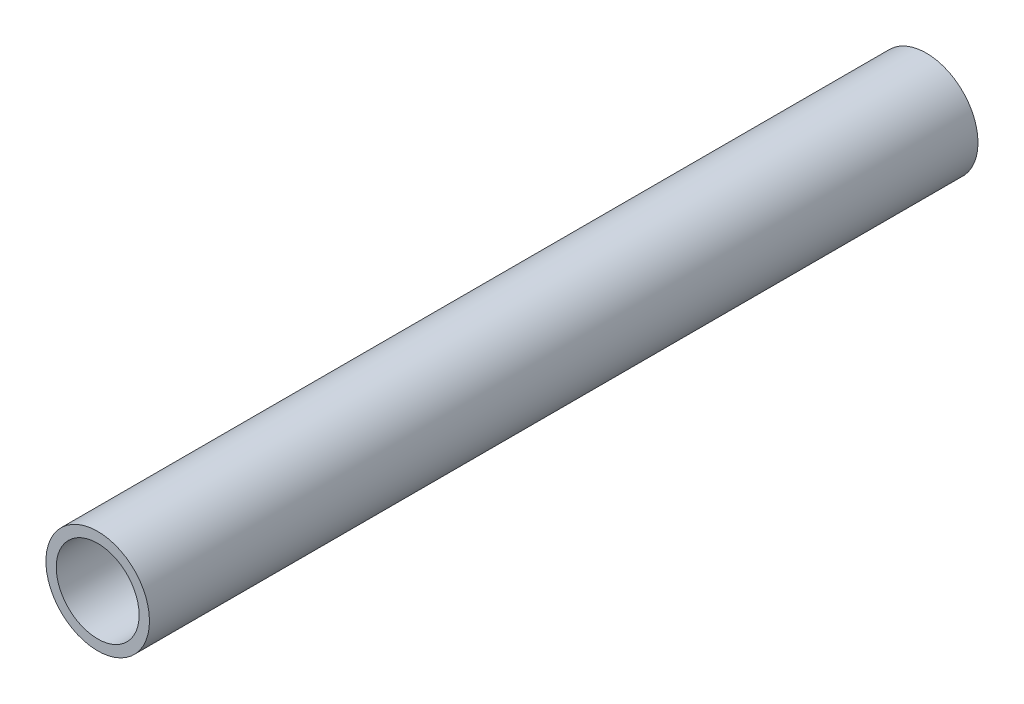
ISO-10303-21;
HEADER;
FILE_DESCRIPTION(('STEP AP214'),'2;1');
FILE_NAME('part.step','',(''),(''),'','','');
FILE_SCHEMA(('AUTOMOTIVE_DESIGN { 1 0 10303 214 1 1 1 1 }'));
ENDSEC;
DATA;
#1=APPLICATION_CONTEXT('core data for automotive mechanical design processes');
#2=APPLICATION_PROTOCOL_DEFINITION('international standard','automotive_design',2000,#1);
#3=PRODUCT_CONTEXT('',#1,'mechanical');
#4=PRODUCT('Part','Part','',(#3));
#5=PRODUCT_RELATED_PRODUCT_CATEGORY('part','',(#4));
#6=PRODUCT_DEFINITION_FORMATION('','',#4);
#7=PRODUCT_DEFINITION_CONTEXT('part definition',#1,'design');
#8=PRODUCT_DEFINITION('design','',#6,#7);
#9=PRODUCT_DEFINITION_SHAPE('','',#8);
#10=(LENGTH_UNIT() NAMED_UNIT(*) SI_UNIT(.MILLI.,.METRE.));
#11=(NAMED_UNIT(*) PLANE_ANGLE_UNIT() SI_UNIT($,.RADIAN.));
#12=(NAMED_UNIT(*) SI_UNIT($,.STERADIAN.) SOLID_ANGLE_UNIT());
#13=UNCERTAINTY_MEASURE_WITH_UNIT(LENGTH_MEASURE(1.E-05),#10,'distance_accuracy_value','');
#14=(GEOMETRIC_REPRESENTATION_CONTEXT(3) GLOBAL_UNCERTAINTY_ASSIGNED_CONTEXT((#13)) GLOBAL_UNIT_ASSIGNED_CONTEXT((#10,
#11,#12)) REPRESENTATION_CONTEXT('',''));
#15=CARTESIAN_POINT('',(0.,0.,0.));
#16=DIRECTION('',(0.,0.,1.));
#17=DIRECTION('',(1.,0.,0.));
#18=AXIS2_PLACEMENT_3D('',#15,#16,#17);
#19=CARTESIAN_POINT('',(0.,0.,160.));
#20=DIRECTION('',(0.,0.,1.));
#21=DIRECTION('',(1.,0.,0.));
#22=AXIS2_PLACEMENT_3D('',#19,#20,#21);
#23=PLANE('',#22);
#24=CARTESIAN_POINT('',(0.,0.,160.));
#25=DIRECTION('',(0.,0.,1.));
#26=DIRECTION('',(1.,0.,0.));
#27=AXIS2_PLACEMENT_3D('',#24,#25,#26);
#28=CIRCLE('',#27,10.);
#29=CARTESIAN_POINT('',(10.,0.,160.));
#30=VERTEX_POINT('',#29);
#31=EDGE_CURVE('E10',#30,#30,#28,.T.);
#32=ORIENTED_EDGE('',*,*,#31,.T.);
#33=EDGE_LOOP('',(#32));
#34=FACE_BOUND('',#33,.T.);
#35=CARTESIAN_POINT('',(0.,0.,160.));
#36=DIRECTION('',(0.,0.,1.));
#37=DIRECTION('',(1.,0.,0.));
#38=AXIS2_PLACEMENT_3D('',#35,#36,#37);
#39=CIRCLE('',#38,8.);
#40=CARTESIAN_POINT('',(8.,0.,160.));
#41=VERTEX_POINT('',#40);
#42=EDGE_CURVE('E42',#41,#41,#39,.T.);
#43=ORIENTED_EDGE('',*,*,#42,.F.);
#44=EDGE_LOOP('',(#43));
#45=FACE_BOUND('',#44,.T.);
#46=ADVANCED_FACE('F31',(#34,#45),#23,.T.);
#47=CARTESIAN_POINT('',(0.,0.,0.));
#48=DIRECTION('',(0.,0.,1.));
#49=DIRECTION('',(1.,0.,0.));
#50=AXIS2_PLACEMENT_3D('',#47,#48,#49);
#51=PLANE('',#50);
#52=CARTESIAN_POINT('',(0.,0.,0.));
#53=DIRECTION('',(0.,0.,1.));
#54=DIRECTION('',(1.,0.,0.));
#55=AXIS2_PLACEMENT_3D('',#52,#53,#54);
#56=CIRCLE('',#55,10.);
#57=CARTESIAN_POINT('',(10.,0.,0.));
#58=VERTEX_POINT('',#57);
#59=EDGE_CURVE('E35',#58,#58,#56,.T.);
#60=ORIENTED_EDGE('',*,*,#59,.F.);
#61=EDGE_LOOP('',(#60));
#62=FACE_BOUND('',#61,.T.);
#63=CARTESIAN_POINT('',(0.,0.,0.));
#64=DIRECTION('',(0.,0.,1.));
#65=DIRECTION('',(1.,0.,0.));
#66=AXIS2_PLACEMENT_3D('',#63,#64,#65);
#67=CIRCLE('',#66,8.);
#68=CARTESIAN_POINT('',(8.,0.,0.));
#69=VERTEX_POINT('',#68);
#70=EDGE_CURVE('E44',#69,#69,#67,.T.);
#71=ORIENTED_EDGE('',*,*,#70,.T.);
#72=EDGE_LOOP('',(#71));
#73=FACE_BOUND('',#72,.T.);
#74=ADVANCED_FACE('F54',(#62,#73),#51,.F.);
#75=CARTESIAN_POINT('',(0.,0.,160.));
#76=DIRECTION('',(0.,0.,-1.));
#77=DIRECTION('',(-1.,0.,0.));
#78=AXIS2_PLACEMENT_3D('',#75,#76,#77);
#79=CYLINDRICAL_SURFACE('',#78,10.);
#80=ORIENTED_EDGE('',*,*,#31,.F.);
#81=EDGE_LOOP('',(#80));
#82=FACE_BOUND('',#81,.T.);
#83=ORIENTED_EDGE('',*,*,#59,.T.);
#84=EDGE_LOOP('',(#83));
#85=FACE_BOUND('',#84,.T.);
#86=ADVANCED_FACE('F33',(#82,#85),#79,.T.);
#87=CARTESIAN_POINT('',(0.,0.,160.));
#88=DIRECTION('',(0.,0.,-1.));
#89=DIRECTION('',(-1.,0.,0.));
#90=AXIS2_PLACEMENT_3D('',#87,#88,#89);
#91=CYLINDRICAL_SURFACE('',#90,8.);
#92=ORIENTED_EDGE('',*,*,#42,.T.);
#93=EDGE_LOOP('',(#92));
#94=FACE_BOUND('',#93,.T.);
#95=ORIENTED_EDGE('',*,*,#70,.F.);
#96=EDGE_LOOP('',(#95));
#97=FACE_BOUND('',#96,.T.);
#98=ADVANCED_FACE('F50',(#94,#97),#91,.F.);
#99=CLOSED_SHELL('',(#46,#74,#86,#98));
#100=MANIFOLD_SOLID_BREP('B2',#99);
#101=ADVANCED_BREP_SHAPE_REPRESENTATION('',(#18,#100),#14);
#102=SHAPE_DEFINITION_REPRESENTATION(#9,#101);
ENDSEC;
END-ISO-10303-21;
